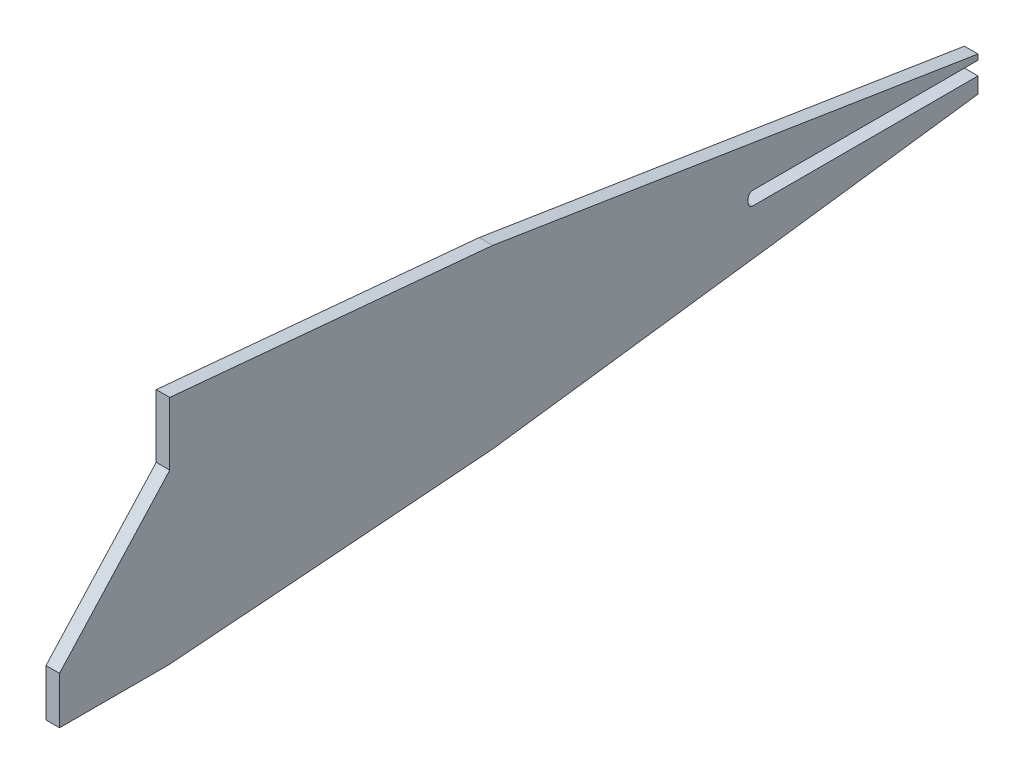
ISO-10303-21;
HEADER;
FILE_DESCRIPTION(('STEP AP214'),'2;1');
FILE_NAME('part.step','',(''),(''),'','','');
FILE_SCHEMA(('AUTOMOTIVE_DESIGN { 1 0 10303 214 1 1 1 1 }'));
ENDSEC;
DATA;
#1=APPLICATION_CONTEXT('core data for automotive mechanical design processes');
#2=APPLICATION_PROTOCOL_DEFINITION('international standard','automotive_design',2000,#1);
#3=PRODUCT_CONTEXT('',#1,'mechanical');
#4=PRODUCT('Part','Part','',(#3));
#5=PRODUCT_RELATED_PRODUCT_CATEGORY('part','',(#4));
#6=PRODUCT_DEFINITION_FORMATION('','',#4);
#7=PRODUCT_DEFINITION_CONTEXT('part definition',#1,'design');
#8=PRODUCT_DEFINITION('design','',#6,#7);
#9=PRODUCT_DEFINITION_SHAPE('','',#8);
#10=(LENGTH_UNIT() NAMED_UNIT(*) SI_UNIT(.MILLI.,.METRE.));
#11=(NAMED_UNIT(*) PLANE_ANGLE_UNIT() SI_UNIT($,.RADIAN.));
#12=(NAMED_UNIT(*) SI_UNIT($,.STERADIAN.) SOLID_ANGLE_UNIT());
#13=UNCERTAINTY_MEASURE_WITH_UNIT(LENGTH_MEASURE(1.E-05),#10,'distance_accuracy_value','');
#14=(GEOMETRIC_REPRESENTATION_CONTEXT(3) GLOBAL_UNCERTAINTY_ASSIGNED_CONTEXT((#13)) GLOBAL_UNIT_ASSIGNED_CONTEXT((#10,
#11,#12)) REPRESENTATION_CONTEXT('',''));
#15=CARTESIAN_POINT('',(0.,0.,0.));
#16=DIRECTION('',(0.,0.,1.));
#17=DIRECTION('',(1.,0.,0.));
#18=AXIS2_PLACEMENT_3D('',#15,#16,#17);
#19=CARTESIAN_POINT('',(-4.3,-0.530689138309698,-513.4));
#20=DIRECTION('',(0.,0.,-1.));
#21=DIRECTION('',(-1.,0.,0.));
#22=AXIS2_PLACEMENT_3D('',#19,#20,#21);
#23=PLANE('',#22);
#24=DIRECTION('',(-1.,0.,0.));
#25=VECTOR('',#24,1.);
#26=CARTESIAN_POINT('',(-4.3,-12.5999999999999,-513.4));
#27=LINE('',#26,#25);
#28=CARTESIAN_POINT('',(4.3,-12.5999999999999,-513.4));
#29=VERTEX_POINT('',#28);
#30=CARTESIAN_POINT('',(-4.3,-12.5999999999999,-513.4));
#31=VERTEX_POINT('',#30);
#32=EDGE_CURVE('E167',#29,#31,#27,.T.);
#33=ORIENTED_EDGE('',*,*,#32,.F.);
#34=DIRECTION('',(0.,1.,0.));
#35=VECTOR('',#34,1.);
#36=CARTESIAN_POINT('',(4.3,-0.530689138309698,-513.4));
#37=LINE('',#36,#35);
#38=CARTESIAN_POINT('',(4.3,-22.6501543513627,-513.4));
#39=VERTEX_POINT('',#38);
#40=EDGE_CURVE('E292',#39,#29,#37,.T.);
#41=ORIENTED_EDGE('',*,*,#40,.F.);
#42=DIRECTION('',(1.,0.,0.));
#43=VECTOR('',#42,1.);
#44=CARTESIAN_POINT('',(-4.3,-22.6501543513627,-513.4));
#45=LINE('',#44,#43);
#46=CARTESIAN_POINT('',(-4.3,-22.6501543513627,-513.4));
#47=VERTEX_POINT('',#46);
#48=EDGE_CURVE('E211',#47,#39,#45,.T.);
#49=ORIENTED_EDGE('',*,*,#48,.F.);
#50=DIRECTION('',(0.,1.,0.));
#51=VECTOR('',#50,1.);
#52=CARTESIAN_POINT('',(-4.3,-0.530689138309698,-513.4));
#53=LINE('',#52,#51);
#54=EDGE_CURVE('E176',#47,#31,#53,.T.);
#55=ORIENTED_EDGE('',*,*,#54,.T.);
#56=EDGE_LOOP('',(#33,#41,#49,#55));
#57=FACE_BOUND('',#56,.T.);
#58=ADVANCED_FACE('F39',(#57),#23,.T.);
#59=CARTESIAN_POINT('',(-4.3,27.2248503298606,0.));
#60=DIRECTION('',(0.,0.673811627905307,0.738903166930282));
#61=DIRECTION('',(0.,-0.738903166930282,0.673811627905307));
#62=AXIS2_PLACEMENT_3D('',#59,#60,#61);
#63=PLANE('',#62);
#64=DIRECTION('',(1.,0.,0.));
#65=VECTOR('',#64,1.);
#66=CARTESIAN_POINT('',(-4.3,-49.5372884386745,70.));
#67=LINE('',#66,#65);
#68=CARTESIAN_POINT('',(-4.3,-49.5372884386745,70.));
#69=VERTEX_POINT('',#68);
#70=CARTESIAN_POINT('',(4.3,-49.5372884386745,70.));
#71=VERTEX_POINT('',#70);
#72=EDGE_CURVE('E197',#69,#71,#67,.T.);
#73=ORIENTED_EDGE('',*,*,#72,.T.);
#74=DIRECTION('',(0.,-0.738903166930282,0.673811627905307));
#75=VECTOR('',#74,1.);
#76=CARTESIAN_POINT('',(4.3,27.2248503298606,0.));
#77=LINE('',#76,#75);
#78=CARTESIAN_POINT('',(4.3,27.2248503298606,0.));
#79=VERTEX_POINT('',#78);
#80=EDGE_CURVE('E272',#79,#71,#77,.T.);
#81=ORIENTED_EDGE('',*,*,#80,.F.);
#82=DIRECTION('',(1.,0.,0.));
#83=VECTOR('',#82,1.);
#84=CARTESIAN_POINT('',(-4.3,27.2248503298606,0.));
#85=LINE('',#84,#83);
#86=CARTESIAN_POINT('',(-4.3,27.2248503298606,0.));
#87=VERTEX_POINT('',#86);
#88=EDGE_CURVE('E198',#87,#79,#85,.T.);
#89=ORIENTED_EDGE('',*,*,#88,.F.);
#90=DIRECTION('',(0.,-0.738903166930282,0.673811627905307));
#91=VECTOR('',#90,1.);
#92=CARTESIAN_POINT('',(-4.3,27.2248503298606,0.));
#93=LINE('',#92,#91);
#94=EDGE_CURVE('E307',#87,#69,#93,.T.);
#95=ORIENTED_EDGE('',*,*,#94,.T.);
#96=EDGE_LOOP('',(#73,#81,#89,#95));
#97=FACE_BOUND('',#96,.T.);
#98=ADVANCED_FACE('F336',(#97),#63,.T.);
#99=CARTESIAN_POINT('',(-4.3,67.2248503298606,0.));
#100=DIRECTION('',(0.,0.,1.));
#101=DIRECTION('',(0.,-1.,0.));
#102=AXIS2_PLACEMENT_3D('',#99,#100,#101);
#103=PLANE('',#102);
#104=ORIENTED_EDGE('',*,*,#88,.T.);
#105=DIRECTION('',(0.,-1.,0.));
#106=VECTOR('',#105,1.);
#107=CARTESIAN_POINT('',(4.3,67.2248503298606,0.));
#108=LINE('',#107,#106);
#109=CARTESIAN_POINT('',(4.3,67.2248503298606,0.));
#110=VERTEX_POINT('',#109);
#111=EDGE_CURVE('E303',#110,#79,#108,.T.);
#112=ORIENTED_EDGE('',*,*,#111,.F.);
#113=DIRECTION('',(1.,0.,0.));
#114=VECTOR('',#113,1.);
#115=CARTESIAN_POINT('',(-4.3,67.2248503298606,0.));
#116=LINE('',#115,#114);
#117=CARTESIAN_POINT('',(-4.3,67.2248503298606,0.));
#118=VERTEX_POINT('',#117);
#119=EDGE_CURVE('E202',#118,#110,#116,.T.);
#120=ORIENTED_EDGE('',*,*,#119,.F.);
#121=DIRECTION('',(0.,-1.,0.));
#122=VECTOR('',#121,1.);
#123=CARTESIAN_POINT('',(-4.3,67.2248503298606,0.));
#124=LINE('',#123,#122);
#125=EDGE_CURVE('E193',#118,#87,#124,.T.);
#126=ORIENTED_EDGE('',*,*,#125,.T.);
#127=EDGE_LOOP('',(#104,#112,#120,#126));
#128=FACE_BOUND('',#127,.T.);
#129=ADVANCED_FACE('F340',(#128),#103,.T.);
#130=CARTESIAN_POINT('',(-4.3,67.2248503298606,0.));
#131=DIRECTION('',(0.,0.995767728619681,-0.0919055528224595));
#132=DIRECTION('',(0.,0.0919055528224595,0.995767728619681));
#133=AXIS2_PLACEMENT_3D('',#130,#131,#132);
#134=PLANE('',#133);
#135=ORIENTED_EDGE('',*,*,#119,.T.);
#136=DIRECTION('',(0.,0.0919055528224595,0.995767728619681));
#137=VECTOR('',#136,1.);
#138=CARTESIAN_POINT('',(4.3,67.2248503298606,0.));
#139=LINE('',#138,#137);
#140=CARTESIAN_POINT('',(4.3,48.288859026105,-205.165503831176));
#141=VERTEX_POINT('',#140);
#142=EDGE_CURVE('E299',#141,#110,#139,.T.);
#143=ORIENTED_EDGE('',*,*,#142,.F.);
#144=DIRECTION('',(1.,0.,0.));
#145=VECTOR('',#144,1.);
#146=CARTESIAN_POINT('',(-4.3,48.288859026105,-205.165503831176));
#147=LINE('',#146,#145);
#148=CARTESIAN_POINT('',(-4.3,48.288859026105,-205.165503831176));
#149=VERTEX_POINT('',#148);
#150=EDGE_CURVE('E205',#149,#141,#147,.T.);
#151=ORIENTED_EDGE('',*,*,#150,.F.);
#152=DIRECTION('',(0.,0.0919055528224595,0.995767728619681));
#153=VECTOR('',#152,1.);
#154=CARTESIAN_POINT('',(-4.3,67.2248503298606,0.));
#155=LINE('',#154,#153);
#156=EDGE_CURVE('E189',#149,#118,#155,.T.);
#157=ORIENTED_EDGE('',*,*,#156,.T.);
#158=EDGE_LOOP('',(#135,#143,#151,#157));
#159=FACE_BOUND('',#158,.T.);
#160=ADVANCED_FACE('F343',(#159),#134,.T.);
#161=CARTESIAN_POINT('',(-4.3,48.288859026105,-205.165503831176));
#162=DIRECTION('',(0.,0.987688340595138,-0.156434465040231));
#163=DIRECTION('',(0.,0.156434465040231,0.987688340595138));
#164=AXIS2_PLACEMENT_3D('',#161,#162,#163);
#165=PLANE('',#164);
#166=ORIENTED_EDGE('',*,*,#150,.T.);
#167=DIRECTION('',(0.,0.156434465040231,0.987688340595138));
#168=VECTOR('',#167,1.);
#169=CARTESIAN_POINT('',(4.3,48.288859026105,-205.165503831176));
#170=LINE('',#169,#168);
#171=CARTESIAN_POINT('',(4.3,-0.530689138309698,-513.4));
#172=VERTEX_POINT('',#171);
#173=EDGE_CURVE('E295',#172,#141,#170,.T.);
#174=ORIENTED_EDGE('',*,*,#173,.F.);
#175=DIRECTION('',(1.,0.,0.));
#176=VECTOR('',#175,1.);
#177=CARTESIAN_POINT('',(-4.3,-0.530689138309698,-513.4));
#178=LINE('',#177,#176);
#179=CARTESIAN_POINT('',(-4.3,-0.530689138309698,-513.4));
#180=VERTEX_POINT('',#179);
#181=EDGE_CURVE('E208',#180,#172,#178,.T.);
#182=ORIENTED_EDGE('',*,*,#181,.F.);
#183=DIRECTION('',(0.,0.156434465040231,0.987688340595138));
#184=VECTOR('',#183,1.);
#185=CARTESIAN_POINT('',(-4.3,48.288859026105,-205.165503831176));
#186=LINE('',#185,#184);
#187=EDGE_CURVE('E174',#180,#149,#186,.T.);
#188=ORIENTED_EDGE('',*,*,#187,.T.);
#189=EDGE_LOOP('',(#166,#174,#182,#188));
#190=FACE_BOUND('',#189,.T.);
#191=ADVANCED_FACE('F345',(#190),#165,.T.);
#192=DIRECTION('',(1.,0.,0.));
#193=VECTOR('',#192,1.);
#194=CARTESIAN_POINT('',(-4.3,-3.99999999999994,-513.4));
#195=LINE('',#194,#193);
#196=CARTESIAN_POINT('',(-4.3,-3.99999999999994,-513.4));
#197=VERTEX_POINT('',#196);
#198=CARTESIAN_POINT('',(4.3,-3.99999999999995,-513.4));
#199=VERTEX_POINT('',#198);
#200=EDGE_CURVE('E149',#197,#199,#195,.T.);
#201=ORIENTED_EDGE('',*,*,#200,.F.);
#202=EDGE_CURVE('E163',#197,#180,#53,.T.);
#203=ORIENTED_EDGE('',*,*,#202,.T.);
#204=ORIENTED_EDGE('',*,*,#181,.T.);
#205=EDGE_CURVE('E165',#199,#172,#37,.T.);
#206=ORIENTED_EDGE('',*,*,#205,.F.);
#207=EDGE_LOOP('',(#201,#203,#204,#206));
#208=FACE_BOUND('',#207,.T.);
#209=ADVANCED_FACE('F161',(#208),#23,.T.);
#210=CARTESIAN_POINT('',(-4.3,-22.6501543513627,-513.4));
#211=DIRECTION('',(0.,-0.991235972394931,-0.132103168131108));
#212=DIRECTION('',(0.,0.132103168131108,-0.991235972394931));
#213=AXIS2_PLACEMENT_3D('',#210,#211,#212);
#214=PLANE('',#213);
#215=ORIENTED_EDGE('',*,*,#48,.T.);
#216=DIRECTION('',(0.,0.132103168131108,-0.991235972394931));
#217=VECTOR('',#216,1.);
#218=CARTESIAN_POINT('',(4.3,-22.6501543513627,-513.4));
#219=LINE('',#218,#217);
#220=CARTESIAN_POINT('',(4.3,-63.7176077513932,-205.250409943522));
#221=VERTEX_POINT('',#220);
#222=EDGE_CURVE('E288',#221,#39,#219,.T.);
#223=ORIENTED_EDGE('',*,*,#222,.F.);
#224=DIRECTION('',(1.,0.,0.));
#225=VECTOR('',#224,1.);
#226=CARTESIAN_POINT('',(-4.3,-63.7176077513932,-205.250409943522));
#227=LINE('',#226,#225);
#228=CARTESIAN_POINT('',(-4.3,-63.7176077513932,-205.250409943522));
#229=VERTEX_POINT('',#228);
#230=EDGE_CURVE('E214',#229,#221,#227,.T.);
#231=ORIENTED_EDGE('',*,*,#230,.F.);
#232=DIRECTION('',(0.,0.132103168131108,-0.991235972394931));
#233=VECTOR('',#232,1.);
#234=CARTESIAN_POINT('',(-4.3,-22.6501543513627,-513.4));
#235=LINE('',#234,#233);
#236=EDGE_CURVE('E177',#229,#47,#235,.T.);
#237=ORIENTED_EDGE('',*,*,#236,.T.);
#238=EDGE_LOOP('',(#215,#223,#231,#237));
#239=FACE_BOUND('',#238,.T.);
#240=ADVANCED_FACE('F366',(#239),#214,.T.);
#241=CARTESIAN_POINT('',(-4.3,-63.7176077513932,-205.250409943522));
#242=DIRECTION('',(0.,-0.997042888850236,-0.0768471066024929));
#243=DIRECTION('',(0.,0.0768471066024929,-0.997042888850237));
#244=AXIS2_PLACEMENT_3D('',#241,#242,#243);
#245=PLANE('',#244);
#246=ORIENTED_EDGE('',*,*,#230,.T.);
#247=DIRECTION('',(0.,0.0768471066024929,-0.997042888850237));
#248=VECTOR('',#247,1.);
#249=CARTESIAN_POINT('',(4.3,-63.7176077513932,-205.250409943522));
#250=LINE('',#249,#248);
#251=CARTESIAN_POINT('',(4.3,-79.5372884386745,0.));
#252=VERTEX_POINT('',#251);
#253=EDGE_CURVE('E284',#252,#221,#250,.T.);
#254=ORIENTED_EDGE('',*,*,#253,.F.);
#255=DIRECTION('',(1.,0.,0.));
#256=VECTOR('',#255,1.);
#257=CARTESIAN_POINT('',(-4.3,-79.5372884386745,0.));
#258=LINE('',#257,#256);
#259=CARTESIAN_POINT('',(-4.3,-79.5372884386745,0.));
#260=VERTEX_POINT('',#259);
#261=EDGE_CURVE('E217',#260,#252,#258,.T.);
#262=ORIENTED_EDGE('',*,*,#261,.F.);
#263=DIRECTION('',(0.,0.0768471066024929,-0.997042888850237));
#264=VECTOR('',#263,1.);
#265=CARTESIAN_POINT('',(-4.3,-63.7176077513932,-205.250409943522));
#266=LINE('',#265,#264);
#267=EDGE_CURVE('E183',#260,#229,#266,.T.);
#268=ORIENTED_EDGE('',*,*,#267,.T.);
#269=EDGE_LOOP('',(#246,#254,#262,#268));
#270=FACE_BOUND('',#269,.T.);
#271=ADVANCED_FACE('F322',(#270),#245,.T.);
#272=CARTESIAN_POINT('',(-4.3,-79.5372884386745,70.));
#273=DIRECTION('',(0.,-1.,0.));
#274=DIRECTION('',(0.,0.,-1.));
#275=AXIS2_PLACEMENT_3D('',#272,#273,#274);
#276=PLANE('',#275);
#277=ORIENTED_EDGE('',*,*,#261,.T.);
#278=DIRECTION('',(0.,0.,-1.));
#279=VECTOR('',#278,1.);
#280=CARTESIAN_POINT('',(4.3,-79.5372884386745,70.));
#281=LINE('',#280,#279);
#282=CARTESIAN_POINT('',(4.3,-79.5372884386745,70.));
#283=VERTEX_POINT('',#282);
#284=EDGE_CURVE('E280',#283,#252,#281,.T.);
#285=ORIENTED_EDGE('',*,*,#284,.F.);
#286=DIRECTION('',(1.,0.,0.));
#287=VECTOR('',#286,1.);
#288=CARTESIAN_POINT('',(-4.3,-79.5372884386745,70.));
#289=LINE('',#288,#287);
#290=CARTESIAN_POINT('',(-4.3,-79.5372884386745,70.));
#291=VERTEX_POINT('',#290);
#292=EDGE_CURVE('E220',#291,#283,#289,.T.);
#293=ORIENTED_EDGE('',*,*,#292,.F.);
#294=DIRECTION('',(0.,0.,-1.));
#295=VECTOR('',#294,1.);
#296=CARTESIAN_POINT('',(-4.3,-79.5372884386745,70.));
#297=LINE('',#296,#295);
#298=EDGE_CURVE('E315',#291,#260,#297,.T.);
#299=ORIENTED_EDGE('',*,*,#298,.T.);
#300=EDGE_LOOP('',(#277,#285,#293,#299));
#301=FACE_BOUND('',#300,.T.);
#302=ADVANCED_FACE('F328',(#301),#276,.T.);
#303=CARTESIAN_POINT('',(-4.3,-49.5372884386745,70.));
#304=DIRECTION('',(0.,0.,1.));
#305=DIRECTION('',(1.,0.,0.));
#306=AXIS2_PLACEMENT_3D('',#303,#304,#305);
#307=PLANE('',#306);
#308=ORIENTED_EDGE('',*,*,#292,.T.);
#309=DIRECTION('',(0.,-1.,0.));
#310=VECTOR('',#309,1.);
#311=CARTESIAN_POINT('',(4.3,-49.5372884386745,70.));
#312=LINE('',#311,#310);
#313=EDGE_CURVE('E276',#71,#283,#312,.T.);
#314=ORIENTED_EDGE('',*,*,#313,.F.);
#315=ORIENTED_EDGE('',*,*,#72,.F.);
#316=DIRECTION('',(0.,-1.,0.));
#317=VECTOR('',#316,1.);
#318=CARTESIAN_POINT('',(-4.3,-49.5372884386745,70.));
#319=LINE('',#318,#317);
#320=EDGE_CURVE('E311',#69,#291,#319,.T.);
#321=ORIENTED_EDGE('',*,*,#320,.T.);
#322=EDGE_LOOP('',(#308,#314,#315,#321));
#323=FACE_BOUND('',#322,.T.);
#324=ADVANCED_FACE('F332',(#323),#307,.T.);
#325=CARTESIAN_POINT('',(-4.3,0.,0.));
#326=DIRECTION('',(1.,0.,0.));
#327=DIRECTION('',(0.,0.,-1.));
#328=AXIS2_PLACEMENT_3D('',#325,#326,#327);
#329=PLANE('',#328);
#330=DIRECTION('',(0.,0.,1.));
#331=VECTOR('',#330,1.);
#332=CARTESIAN_POINT('',(-4.3,-3.99999999999994,-519.4));
#333=LINE('',#332,#331);
#334=CARTESIAN_POINT('',(-4.3,-3.99999999999996,-370.4));
#335=VERTEX_POINT('',#334);
#336=EDGE_CURVE('E145',#197,#335,#333,.T.);
#337=ORIENTED_EDGE('',*,*,#336,.T.);
#338=CARTESIAN_POINT('',(-4.3,-6.99999999999995,-370.4));
#339=DIRECTION('',(1.,0.,0.));
#340=DIRECTION('',(0.,0.,-1.));
#341=AXIS2_PLACEMENT_3D('',#338,#339,#340);
#342=CIRCLE('',#341,3.);
#343=CARTESIAN_POINT('',(-4.3,-6.99999999999995,-367.4));
#344=VERTEX_POINT('',#343);
#345=EDGE_CURVE('E242',#335,#344,#342,.T.);
#346=ORIENTED_EDGE('',*,*,#345,.T.);
#347=DIRECTION('',(0.,-1.,0.));
#348=VECTOR('',#347,1.);
#349=CARTESIAN_POINT('',(-4.3,-3.99999999999996,-367.4));
#350=LINE('',#349,#348);
#351=CARTESIAN_POINT('',(-4.3,-9.59999999999995,-367.4));
#352=VERTEX_POINT('',#351);
#353=EDGE_CURVE('E156',#344,#352,#350,.T.);
#354=ORIENTED_EDGE('',*,*,#353,.T.);
#355=CARTESIAN_POINT('',(-4.3,-9.59999999999996,-370.4));
#356=DIRECTION('',(1.,0.,0.));
#357=DIRECTION('',(0.,0.,-1.));
#358=AXIS2_PLACEMENT_3D('',#355,#356,#357);
#359=CIRCLE('',#358,3.);
#360=CARTESIAN_POINT('',(-4.3,-12.6,-370.4));
#361=VERTEX_POINT('',#360);
#362=EDGE_CURVE('E11',#352,#361,#359,.T.);
#363=ORIENTED_EDGE('',*,*,#362,.T.);
#364=DIRECTION('',(0.,0.,-1.));
#365=VECTOR('',#364,1.);
#366=CARTESIAN_POINT('',(-4.3,-12.5999999999999,-519.4));
#367=LINE('',#366,#365);
#368=EDGE_CURVE('E168',#361,#31,#367,.T.);
#369=ORIENTED_EDGE('',*,*,#368,.T.);
#370=ORIENTED_EDGE('',*,*,#54,.F.);
#371=ORIENTED_EDGE('',*,*,#236,.F.);
#372=ORIENTED_EDGE('',*,*,#267,.F.);
#373=ORIENTED_EDGE('',*,*,#298,.F.);
#374=ORIENTED_EDGE('',*,*,#320,.F.);
#375=ORIENTED_EDGE('',*,*,#94,.F.);
#376=ORIENTED_EDGE('',*,*,#125,.F.);
#377=ORIENTED_EDGE('',*,*,#156,.F.);
#378=ORIENTED_EDGE('',*,*,#187,.F.);
#379=ORIENTED_EDGE('',*,*,#202,.F.);
#380=EDGE_LOOP('',(#337,#346,#354,#363,#369,#370,#371,#372,#373,#374,#375,#376,#377,#378,#379));
#381=FACE_BOUND('',#380,.T.);
#382=ADVANCED_FACE('F171',(#381),#329,.F.);
#383=CARTESIAN_POINT('',(4.3,0.,0.));
#384=DIRECTION('',(1.,0.,0.));
#385=DIRECTION('',(0.,0.,-1.));
#386=AXIS2_PLACEMENT_3D('',#383,#384,#385);
#387=PLANE('',#386);
#388=DIRECTION('',(0.,0.,-1.));
#389=VECTOR('',#388,1.);
#390=CARTESIAN_POINT('',(4.3,-12.5999999999999,-519.4));
#391=LINE('',#390,#389);
#392=CARTESIAN_POINT('',(4.3,-12.6,-370.4));
#393=VERTEX_POINT('',#392);
#394=EDGE_CURVE('E157',#393,#29,#391,.T.);
#395=ORIENTED_EDGE('',*,*,#394,.F.);
#396=CARTESIAN_POINT('',(4.3,-9.59999999999996,-370.4));
#397=DIRECTION('',(1.,0.,0.));
#398=DIRECTION('',(0.,0.,-1.));
#399=AXIS2_PLACEMENT_3D('',#396,#397,#398);
#400=CIRCLE('',#399,3.);
#401=CARTESIAN_POINT('',(4.3,-9.59999999999995,-367.4));
#402=VERTEX_POINT('',#401);
#403=EDGE_CURVE('E48',#393,#402,#400,.F.);
#404=ORIENTED_EDGE('',*,*,#403,.T.);
#405=DIRECTION('',(0.,-1.,0.));
#406=VECTOR('',#405,1.);
#407=CARTESIAN_POINT('',(4.3,-3.99999999999996,-367.4));
#408=LINE('',#407,#406);
#409=CARTESIAN_POINT('',(4.3,-6.99999999999995,-367.4));
#410=VERTEX_POINT('',#409);
#411=EDGE_CURVE('E250',#410,#402,#408,.T.);
#412=ORIENTED_EDGE('',*,*,#411,.F.);
#413=CARTESIAN_POINT('',(4.3,-6.99999999999995,-370.4));
#414=DIRECTION('',(1.,0.,0.));
#415=DIRECTION('',(0.,0.,-1.));
#416=AXIS2_PLACEMENT_3D('',#413,#414,#415);
#417=CIRCLE('',#416,3.);
#418=CARTESIAN_POINT('',(4.3,-3.99999999999995,-370.4));
#419=VERTEX_POINT('',#418);
#420=EDGE_CURVE('E239',#410,#419,#417,.F.);
#421=ORIENTED_EDGE('',*,*,#420,.T.);
#422=DIRECTION('',(0.,0.,1.));
#423=VECTOR('',#422,1.);
#424=CARTESIAN_POINT('',(4.3,-4.,0.));
#425=LINE('',#424,#423);
#426=EDGE_CURVE('E201',#199,#419,#425,.T.);
#427=ORIENTED_EDGE('',*,*,#426,.F.);
#428=ORIENTED_EDGE('',*,*,#205,.T.);
#429=ORIENTED_EDGE('',*,*,#173,.T.);
#430=ORIENTED_EDGE('',*,*,#142,.T.);
#431=ORIENTED_EDGE('',*,*,#111,.T.);
#432=ORIENTED_EDGE('',*,*,#80,.T.);
#433=ORIENTED_EDGE('',*,*,#313,.T.);
#434=ORIENTED_EDGE('',*,*,#284,.T.);
#435=ORIENTED_EDGE('',*,*,#253,.T.);
#436=ORIENTED_EDGE('',*,*,#222,.T.);
#437=ORIENTED_EDGE('',*,*,#40,.T.);
#438=EDGE_LOOP('',(#395,#404,#412,#421,#427,#428,#429,#430,#431,#432,#433,#434,#435,#436,#437));
#439=FACE_BOUND('',#438,.T.);
#440=ADVANCED_FACE('F249',(#439),#387,.T.);
#441=CARTESIAN_POINT('',(-4.3,-12.5999999999999,-519.4));
#442=DIRECTION('',(0.,-1.,0.));
#443=DIRECTION('',(0.,0.,-1.));
#444=AXIS2_PLACEMENT_3D('',#441,#442,#443);
#445=PLANE('',#444);
#446=ORIENTED_EDGE('',*,*,#368,.F.);
#447=DIRECTION('',(1.,0.,0.));
#448=VECTOR('',#447,1.);
#449=CARTESIAN_POINT('',(4.3,-12.6,-370.4));
#450=LINE('',#449,#448);
#451=EDGE_CURVE('E236',#361,#393,#450,.T.);
#452=ORIENTED_EDGE('',*,*,#451,.T.);
#453=ORIENTED_EDGE('',*,*,#394,.T.);
#454=ORIENTED_EDGE('',*,*,#32,.T.);
#455=EDGE_LOOP('',(#446,#452,#453,#454));
#456=FACE_BOUND('',#455,.T.);
#457=ADVANCED_FACE('F259',(#456),#445,.F.);
#458=CARTESIAN_POINT('',(-4.3,-3.99999999999996,-367.4));
#459=DIRECTION('',(0.,0.,1.));
#460=DIRECTION('',(1.,0.,0.));
#461=AXIS2_PLACEMENT_3D('',#458,#459,#460);
#462=PLANE('',#461);
#463=ORIENTED_EDGE('',*,*,#353,.F.);
#464=DIRECTION('',(1.,0.,0.));
#465=VECTOR('',#464,1.);
#466=CARTESIAN_POINT('',(4.3,-6.99999999999995,-367.4));
#467=LINE('',#466,#465);
#468=EDGE_CURVE('E230',#344,#410,#467,.T.);
#469=ORIENTED_EDGE('',*,*,#468,.T.);
#470=ORIENTED_EDGE('',*,*,#411,.T.);
#471=DIRECTION('',(1.,0.,0.));
#472=VECTOR('',#471,1.);
#473=CARTESIAN_POINT('',(-4.3,-9.59999999999996,-367.4));
#474=LINE('',#473,#472);
#475=EDGE_CURVE('E227',#402,#352,#474,.F.);
#476=ORIENTED_EDGE('',*,*,#475,.T.);
#477=EDGE_LOOP('',(#463,#469,#470,#476));
#478=FACE_BOUND('',#477,.T.);
#479=ADVANCED_FACE('F254',(#478),#462,.F.);
#480=CARTESIAN_POINT('',(-4.3,-3.99999999999994,-519.4));
#481=DIRECTION('',(0.,1.,0.));
#482=DIRECTION('',(0.,0.,1.));
#483=AXIS2_PLACEMENT_3D('',#480,#481,#482);
#484=PLANE('',#483);
#485=ORIENTED_EDGE('',*,*,#426,.T.);
#486=DIRECTION('',(1.,0.,0.));
#487=VECTOR('',#486,1.);
#488=CARTESIAN_POINT('',(-4.3,-3.99999999999996,-370.4));
#489=LINE('',#488,#487);
#490=EDGE_CURVE('E152',#419,#335,#489,.F.);
#491=ORIENTED_EDGE('',*,*,#490,.T.);
#492=ORIENTED_EDGE('',*,*,#336,.F.);
#493=ORIENTED_EDGE('',*,*,#200,.T.);
#494=EDGE_LOOP('',(#485,#491,#492,#493));
#495=FACE_BOUND('',#494,.T.);
#496=ADVANCED_FACE('F148',(#495),#484,.F.);
#497=CARTESIAN_POINT('',(-4.3,-6.99999999999995,-370.4));
#498=DIRECTION('',(-1.,0.,0.));
#499=DIRECTION('',(0.,0.,1.));
#500=AXIS2_PLACEMENT_3D('',#497,#498,#499);
#501=CYLINDRICAL_SURFACE('',#500,3.);
#502=ORIENTED_EDGE('',*,*,#345,.F.);
#503=ORIENTED_EDGE('',*,*,#490,.F.);
#504=ORIENTED_EDGE('',*,*,#420,.F.);
#505=ORIENTED_EDGE('',*,*,#468,.F.);
#506=EDGE_LOOP('',(#502,#503,#504,#505));
#507=FACE_BOUND('',#506,.T.);
#508=ADVANCED_FACE('F349',(#507),#501,.F.);
#509=CARTESIAN_POINT('',(-4.3,-9.59999999999996,-370.4));
#510=DIRECTION('',(-1.,0.,0.));
#511=DIRECTION('',(0.,0.,1.));
#512=AXIS2_PLACEMENT_3D('',#509,#510,#511);
#513=CYLINDRICAL_SURFACE('',#512,3.);
#514=ORIENTED_EDGE('',*,*,#362,.F.);
#515=ORIENTED_EDGE('',*,*,#475,.F.);
#516=ORIENTED_EDGE('',*,*,#403,.F.);
#517=ORIENTED_EDGE('',*,*,#451,.F.);
#518=EDGE_LOOP('',(#514,#515,#516,#517));
#519=FACE_BOUND('',#518,.T.);
#520=ADVANCED_FACE('F41',(#519),#513,.F.);
#521=CLOSED_SHELL('',(#58,#98,#129,#160,#191,#209,#240,#271,#302,#324,#382,#440,#457,#479,#496,
#508,#520));
#522=MANIFOLD_SOLID_BREP('B2',#521);
#523=ADVANCED_BREP_SHAPE_REPRESENTATION('',(#18,#522),#14);
#524=SHAPE_DEFINITION_REPRESENTATION(#9,#523);
ENDSEC;
END-ISO-10303-21;
